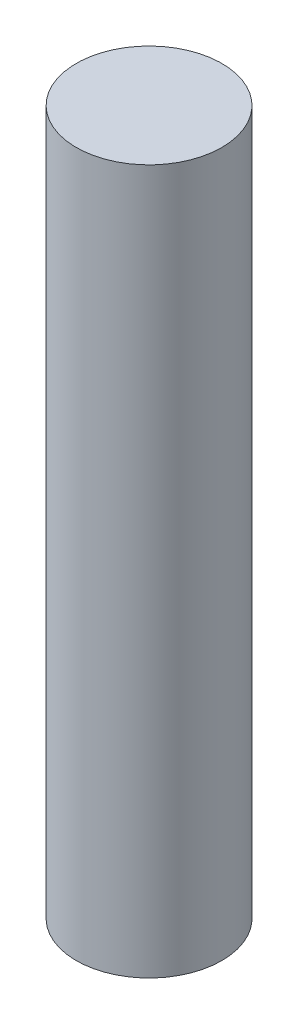
ISO-10303-21;
HEADER;
FILE_DESCRIPTION(('STEP AP214'),'2;1');
FILE_NAME('part.step','',(''),(''),'','','');
FILE_SCHEMA(('AUTOMOTIVE_DESIGN { 1 0 10303 214 1 1 1 1 }'));
ENDSEC;
DATA;
#1=APPLICATION_CONTEXT('core data for automotive mechanical design processes');
#2=APPLICATION_PROTOCOL_DEFINITION('international standard','automotive_design',2000,#1);
#3=PRODUCT_CONTEXT('',#1,'mechanical');
#4=PRODUCT('Part','Part','',(#3));
#5=PRODUCT_RELATED_PRODUCT_CATEGORY('part','',(#4));
#6=PRODUCT_DEFINITION_FORMATION('','',#4);
#7=PRODUCT_DEFINITION_CONTEXT('part definition',#1,'design');
#8=PRODUCT_DEFINITION('design','',#6,#7);
#9=PRODUCT_DEFINITION_SHAPE('','',#8);
#10=(LENGTH_UNIT() NAMED_UNIT(*) SI_UNIT(.MILLI.,.METRE.));
#11=(NAMED_UNIT(*) PLANE_ANGLE_UNIT() SI_UNIT($,.RADIAN.));
#12=(NAMED_UNIT(*) SI_UNIT($,.STERADIAN.) SOLID_ANGLE_UNIT());
#13=UNCERTAINTY_MEASURE_WITH_UNIT(LENGTH_MEASURE(1.E-05),#10,'distance_accuracy_value','');
#14=(GEOMETRIC_REPRESENTATION_CONTEXT(3) GLOBAL_UNCERTAINTY_ASSIGNED_CONTEXT((#13)) GLOBAL_UNIT_ASSIGNED_CONTEXT((#10,
#11,#12)) REPRESENTATION_CONTEXT('',''));
#15=CARTESIAN_POINT('',(0.,0.,0.));
#16=DIRECTION('',(0.,0.,1.));
#17=DIRECTION('',(1.,0.,0.));
#18=AXIS2_PLACEMENT_3D('',#15,#16,#17);
#19=CARTESIAN_POINT('',(0.,590.,0.));
#20=DIRECTION('',(0.,-1.,0.));
#21=DIRECTION('',(0.,0.,-1.));
#22=AXIS2_PLACEMENT_3D('',#19,#20,#21);
#23=CYLINDRICAL_SURFACE('',#22,61.);
#24=CARTESIAN_POINT('',(0.,590.,0.));
#25=DIRECTION('',(0.,1.,0.));
#26=DIRECTION('',(1.,0.,0.));
#27=AXIS2_PLACEMENT_3D('',#24,#25,#26);
#28=CIRCLE('',#27,61.);
#29=CARTESIAN_POINT('',(61.,590.,0.));
#30=VERTEX_POINT('',#29);
#31=EDGE_CURVE('E10',#30,#30,#28,.T.);
#32=ORIENTED_EDGE('',*,*,#31,.F.);
#33=EDGE_LOOP('',(#32));
#34=FACE_BOUND('',#33,.T.);
#35=CARTESIAN_POINT('',(0.,0.,0.));
#36=DIRECTION('',(0.,1.,0.));
#37=DIRECTION('',(1.,0.,0.));
#38=AXIS2_PLACEMENT_3D('',#35,#36,#37);
#39=CIRCLE('',#38,61.);
#40=CARTESIAN_POINT('',(61.,0.,0.));
#41=VERTEX_POINT('',#40);
#42=EDGE_CURVE('E43',#41,#41,#39,.T.);
#43=ORIENTED_EDGE('',*,*,#42,.T.);
#44=EDGE_LOOP('',(#43));
#45=FACE_BOUND('',#44,.T.);
#46=ADVANCED_FACE('F40',(#34,#45),#23,.T.);
#47=CARTESIAN_POINT('',(0.,590.,0.));
#48=DIRECTION('',(0.,1.,0.));
#49=DIRECTION('',(0.,0.,1.));
#50=AXIS2_PLACEMENT_3D('',#47,#48,#49);
#51=PLANE('',#50);
#52=ORIENTED_EDGE('',*,*,#31,.T.);
#53=EDGE_LOOP('',(#52));
#54=FACE_BOUND('',#53,.T.);
#55=ADVANCED_FACE('F75',(#54),#51,.T.);
#56=CARTESIAN_POINT('',(0.,0.,0.));
#57=DIRECTION('',(0.,1.,0.));
#58=DIRECTION('',(0.,0.,1.));
#59=AXIS2_PLACEMENT_3D('',#56,#57,#58);
#60=PLANE('',#59);
#61=ORIENTED_EDGE('',*,*,#42,.F.);
#62=EDGE_LOOP('',(#61));
#63=FACE_BOUND('',#62,.T.);
#64=ADVANCED_FACE('F77',(#63),#60,.F.);
#65=CLOSED_SHELL('',(#46,#55,#64));
#66=CARTESIAN_POINT('',(0.,588.,0.));
#67=DIRECTION('',(0.,-1.,0.));
#68=DIRECTION('',(0.,0.,-1.));
#69=AXIS2_PLACEMENT_3D('',#66,#67,#68);
#70=CYLINDRICAL_SURFACE('',#69,59.);
#71=CARTESIAN_POINT('',(0.,588.,0.));
#72=DIRECTION('',(0.,1.,0.));
#73=DIRECTION('',(0.,0.,1.));
#74=AXIS2_PLACEMENT_3D('',#71,#72,#73);
#75=CIRCLE('',#74,59.);
#76=CARTESIAN_POINT('',(0.,588.,59.));
#77=VERTEX_POINT('',#76);
#78=EDGE_CURVE('E50',#77,#77,#75,.T.);
#79=ORIENTED_EDGE('',*,*,#78,.T.);
#80=EDGE_LOOP('',(#79));
#81=FACE_BOUND('',#80,.T.);
#82=CARTESIAN_POINT('',(0.,2.,0.));
#83=DIRECTION('',(0.,1.,0.));
#84=DIRECTION('',(0.,0.,1.));
#85=AXIS2_PLACEMENT_3D('',#82,#83,#84);
#86=CIRCLE('',#85,59.);
#87=CARTESIAN_POINT('',(0.,2.,59.));
#88=VERTEX_POINT('',#87);
#89=EDGE_CURVE('E52',#88,#88,#86,.T.);
#90=ORIENTED_EDGE('',*,*,#89,.F.);
#91=EDGE_LOOP('',(#90));
#92=FACE_BOUND('',#91,.T.);
#93=ADVANCED_FACE('F58',(#81,#92),#70,.F.);
#94=CARTESIAN_POINT('',(0.,588.,0.));
#95=DIRECTION('',(0.,1.,0.));
#96=DIRECTION('',(0.,0.,1.));
#97=AXIS2_PLACEMENT_3D('',#94,#95,#96);
#98=PLANE('',#97);
#99=ORIENTED_EDGE('',*,*,#78,.F.);
#100=EDGE_LOOP('',(#99));
#101=FACE_BOUND('',#100,.T.);
#102=ADVANCED_FACE('F61',(#101),#98,.F.);
#103=CARTESIAN_POINT('',(0.,2.,0.));
#104=DIRECTION('',(0.,1.,0.));
#105=DIRECTION('',(0.,0.,1.));
#106=AXIS2_PLACEMENT_3D('',#103,#104,#105);
#107=PLANE('',#106);
#108=ORIENTED_EDGE('',*,*,#89,.T.);
#109=EDGE_LOOP('',(#108));
#110=FACE_BOUND('',#109,.T.);
#111=ADVANCED_FACE('F63',(#110),#107,.T.);
#112=CLOSED_SHELL('',(#93,#102,#111));
#113=ORIENTED_CLOSED_SHELL('',*,#112,.T.);
#114=BREP_WITH_VOIDS('B2',#65,(#113));
#115=ADVANCED_BREP_SHAPE_REPRESENTATION('',(#18,#114),#14);
#116=SHAPE_DEFINITION_REPRESENTATION(#9,#115);
ENDSEC;
END-ISO-10303-21;
